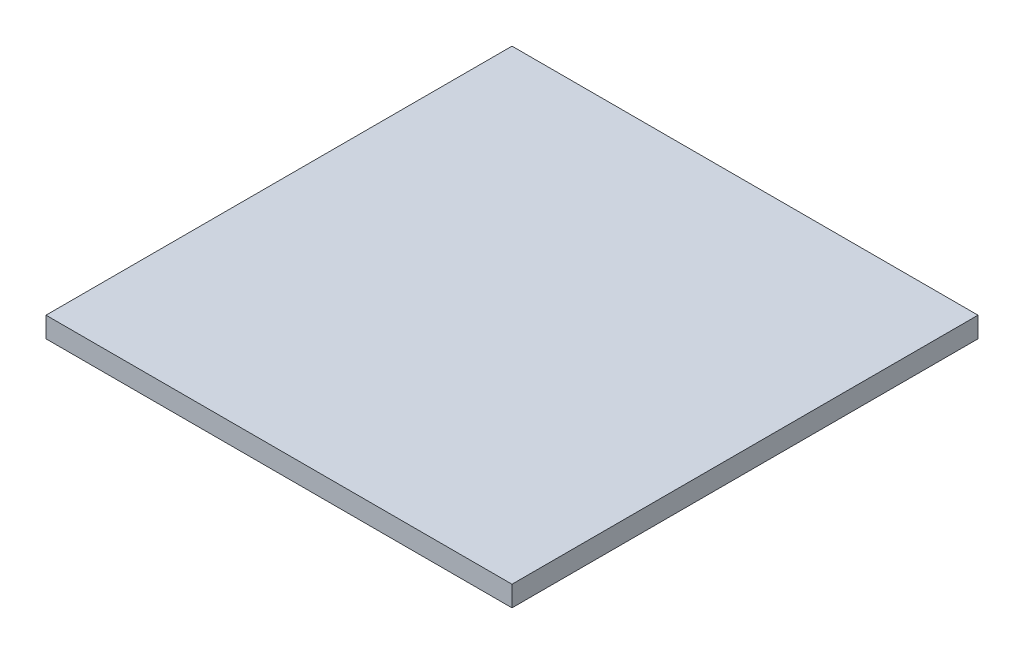
ISO-10303-21;
HEADER;
FILE_DESCRIPTION(('STEP AP214'),'2;1');
FILE_NAME('part.step','',(''),(''),'','','');
FILE_SCHEMA(('AUTOMOTIVE_DESIGN { 1 0 10303 214 1 1 1 1 }'));
ENDSEC;
DATA;
#1=APPLICATION_CONTEXT('core data for automotive mechanical design processes');
#2=APPLICATION_PROTOCOL_DEFINITION('international standard','automotive_design',2000,#1);
#3=PRODUCT_CONTEXT('',#1,'mechanical');
#4=PRODUCT('Part','Part','',(#3));
#5=PRODUCT_RELATED_PRODUCT_CATEGORY('part','',(#4));
#6=PRODUCT_DEFINITION_FORMATION('','',#4);
#7=PRODUCT_DEFINITION_CONTEXT('part definition',#1,'design');
#8=PRODUCT_DEFINITION('design','',#6,#7);
#9=PRODUCT_DEFINITION_SHAPE('','',#8);
#10=(LENGTH_UNIT() NAMED_UNIT(*) SI_UNIT(.MILLI.,.METRE.));
#11=(NAMED_UNIT(*) PLANE_ANGLE_UNIT() SI_UNIT($,.RADIAN.));
#12=(NAMED_UNIT(*) SI_UNIT($,.STERADIAN.) SOLID_ANGLE_UNIT());
#13=UNCERTAINTY_MEASURE_WITH_UNIT(LENGTH_MEASURE(1.E-05),#10,'distance_accuracy_value','');
#14=(GEOMETRIC_REPRESENTATION_CONTEXT(3) GLOBAL_UNCERTAINTY_ASSIGNED_CONTEXT((#13)) GLOBAL_UNIT_ASSIGNED_CONTEXT((#10,
#11,#12)) REPRESENTATION_CONTEXT('',''));
#15=CARTESIAN_POINT('',(0.,0.,0.));
#16=DIRECTION('',(0.,0.,1.));
#17=DIRECTION('',(1.,0.,0.));
#18=AXIS2_PLACEMENT_3D('',#15,#16,#17);
#19=CARTESIAN_POINT('',(0.,1.1,0.));
#20=DIRECTION('',(1.,0.,0.));
#21=DIRECTION('',(0.,0.,-1.));
#22=AXIS2_PLACEMENT_3D('',#19,#20,#21);
#23=PLANE('',#22);
#24=DIRECTION('',(0.,0.,1.));
#25=VECTOR('',#24,1.);
#26=CARTESIAN_POINT('',(0.,0.,0.));
#27=LINE('',#26,#25);
#28=CARTESIAN_POINT('',(0.,0.,-25.));
#29=VERTEX_POINT('',#28);
#30=CARTESIAN_POINT('',(0.,0.,0.));
#31=VERTEX_POINT('',#30);
#32=EDGE_CURVE('E101',#29,#31,#27,.T.);
#33=ORIENTED_EDGE('',*,*,#32,.T.);
#34=DIRECTION('',(0.,-1.,0.));
#35=VECTOR('',#34,1.);
#36=CARTESIAN_POINT('',(0.,1.1,0.));
#37=LINE('',#36,#35);
#38=CARTESIAN_POINT('',(0.,1.1,0.));
#39=VERTEX_POINT('',#38);
#40=EDGE_CURVE('E11',#39,#31,#37,.T.);
#41=ORIENTED_EDGE('',*,*,#40,.F.);
#42=DIRECTION('',(0.,0.,1.));
#43=VECTOR('',#42,1.);
#44=CARTESIAN_POINT('',(0.,1.1,0.));
#45=LINE('',#44,#43);
#46=CARTESIAN_POINT('',(0.,1.1,-25.));
#47=VERTEX_POINT('',#46);
#48=EDGE_CURVE('E89',#47,#39,#45,.T.);
#49=ORIENTED_EDGE('',*,*,#48,.F.);
#50=DIRECTION('',(0.,-1.,0.));
#51=VECTOR('',#50,1.);
#52=CARTESIAN_POINT('',(0.,1.1,-25.));
#53=LINE('',#52,#51);
#54=EDGE_CURVE('E97',#47,#29,#53,.T.);
#55=ORIENTED_EDGE('',*,*,#54,.T.);
#56=EDGE_LOOP('',(#33,#41,#49,#55));
#57=FACE_BOUND('',#56,.T.);
#58=ADVANCED_FACE('F38',(#57),#23,.F.);
#59=CARTESIAN_POINT('',(0.,1.1,0.));
#60=DIRECTION('',(0.,0.,-1.));
#61=DIRECTION('',(-1.,0.,0.));
#62=AXIS2_PLACEMENT_3D('',#59,#60,#61);
#63=PLANE('',#62);
#64=DIRECTION('',(1.,0.,0.));
#65=VECTOR('',#64,1.);
#66=CARTESIAN_POINT('',(0.,0.,0.));
#67=LINE('',#66,#65);
#68=CARTESIAN_POINT('',(25.,0.,0.));
#69=VERTEX_POINT('',#68);
#70=EDGE_CURVE('E93',#31,#69,#67,.T.);
#71=ORIENTED_EDGE('',*,*,#70,.T.);
#72=DIRECTION('',(0.,-1.,0.));
#73=VECTOR('',#72,1.);
#74=CARTESIAN_POINT('',(25.,1.1,0.));
#75=LINE('',#74,#73);
#76=CARTESIAN_POINT('',(25.,1.1,0.));
#77=VERTEX_POINT('',#76);
#78=EDGE_CURVE('E46',#77,#69,#75,.T.);
#79=ORIENTED_EDGE('',*,*,#78,.F.);
#80=DIRECTION('',(1.,0.,0.));
#81=VECTOR('',#80,1.);
#82=CARTESIAN_POINT('',(0.,1.1,0.));
#83=LINE('',#82,#81);
#84=EDGE_CURVE('E84',#39,#77,#83,.T.);
#85=ORIENTED_EDGE('',*,*,#84,.F.);
#86=ORIENTED_EDGE('',*,*,#40,.T.);
#87=EDGE_LOOP('',(#71,#79,#85,#86));
#88=FACE_BOUND('',#87,.T.);
#89=ADVANCED_FACE('F92',(#88),#63,.F.);
#90=CARTESIAN_POINT('',(25.,1.1,0.));
#91=DIRECTION('',(-1.,0.,0.));
#92=DIRECTION('',(0.,0.,1.));
#93=AXIS2_PLACEMENT_3D('',#90,#91,#92);
#94=PLANE('',#93);
#95=DIRECTION('',(0.,0.,-1.));
#96=VECTOR('',#95,1.);
#97=CARTESIAN_POINT('',(25.,0.,0.));
#98=LINE('',#97,#96);
#99=CARTESIAN_POINT('',(25.,0.,-25.));
#100=VERTEX_POINT('',#99);
#101=EDGE_CURVE('E71',#69,#100,#98,.T.);
#102=ORIENTED_EDGE('',*,*,#101,.T.);
#103=DIRECTION('',(0.,-1.,0.));
#104=VECTOR('',#103,1.);
#105=CARTESIAN_POINT('',(25.,1.1,-25.));
#106=LINE('',#105,#104);
#107=CARTESIAN_POINT('',(25.,1.1,-25.));
#108=VERTEX_POINT('',#107);
#109=EDGE_CURVE('E94',#108,#100,#106,.T.);
#110=ORIENTED_EDGE('',*,*,#109,.F.);
#111=DIRECTION('',(0.,0.,-1.));
#112=VECTOR('',#111,1.);
#113=CARTESIAN_POINT('',(25.,1.1,0.));
#114=LINE('',#113,#112);
#115=EDGE_CURVE('E87',#77,#108,#114,.T.);
#116=ORIENTED_EDGE('',*,*,#115,.F.);
#117=ORIENTED_EDGE('',*,*,#78,.T.);
#118=EDGE_LOOP('',(#102,#110,#116,#117));
#119=FACE_BOUND('',#118,.T.);
#120=ADVANCED_FACE('F95',(#119),#94,.F.);
#121=CARTESIAN_POINT('',(0.,1.1,-25.));
#122=DIRECTION('',(0.,0.,1.));
#123=DIRECTION('',(1.,0.,0.));
#124=AXIS2_PLACEMENT_3D('',#121,#122,#123);
#125=PLANE('',#124);
#126=DIRECTION('',(-1.,0.,0.));
#127=VECTOR('',#126,1.);
#128=CARTESIAN_POINT('',(0.,0.,-25.));
#129=LINE('',#128,#127);
#130=EDGE_CURVE('E77',#100,#29,#129,.T.);
#131=ORIENTED_EDGE('',*,*,#130,.T.);
#132=ORIENTED_EDGE('',*,*,#54,.F.);
#133=DIRECTION('',(-1.,0.,0.));
#134=VECTOR('',#133,1.);
#135=CARTESIAN_POINT('',(0.,1.1,-25.));
#136=LINE('',#135,#134);
#137=EDGE_CURVE('E54',#108,#47,#136,.T.);
#138=ORIENTED_EDGE('',*,*,#137,.F.);
#139=ORIENTED_EDGE('',*,*,#109,.T.);
#140=EDGE_LOOP('',(#131,#132,#138,#139));
#141=FACE_BOUND('',#140,.T.);
#142=ADVANCED_FACE('F108',(#141),#125,.F.);
#143=CARTESIAN_POINT('',(0.,1.1,0.));
#144=DIRECTION('',(0.,-1.,0.));
#145=DIRECTION('',(0.,0.,-1.));
#146=AXIS2_PLACEMENT_3D('',#143,#144,#145);
#147=PLANE('',#146);
#148=ORIENTED_EDGE('',*,*,#48,.T.);
#149=ORIENTED_EDGE('',*,*,#84,.T.);
#150=ORIENTED_EDGE('',*,*,#115,.T.);
#151=ORIENTED_EDGE('',*,*,#137,.T.);
#152=EDGE_LOOP('',(#148,#149,#150,#151));
#153=FACE_BOUND('',#152,.T.);
#154=ADVANCED_FACE('F85',(#153),#147,.F.);
#155=CARTESIAN_POINT('',(0.,0.,0.));
#156=DIRECTION('',(0.,-1.,0.));
#157=DIRECTION('',(0.,0.,-1.));
#158=AXIS2_PLACEMENT_3D('',#155,#156,#157);
#159=PLANE('',#158);
#160=ORIENTED_EDGE('',*,*,#32,.F.);
#161=ORIENTED_EDGE('',*,*,#130,.F.);
#162=ORIENTED_EDGE('',*,*,#101,.F.);
#163=ORIENTED_EDGE('',*,*,#70,.F.);
#164=EDGE_LOOP('',(#160,#161,#162,#163));
#165=FACE_BOUND('',#164,.T.);
#166=ADVANCED_FACE('F111',(#165),#159,.T.);
#167=CLOSED_SHELL('',(#58,#89,#120,#142,#154,#166));
#168=MANIFOLD_SOLID_BREP('B2',#167);
#169=ADVANCED_BREP_SHAPE_REPRESENTATION('',(#18,#168),#14);
#170=SHAPE_DEFINITION_REPRESENTATION(#9,#169);
ENDSEC;
END-ISO-10303-21;
